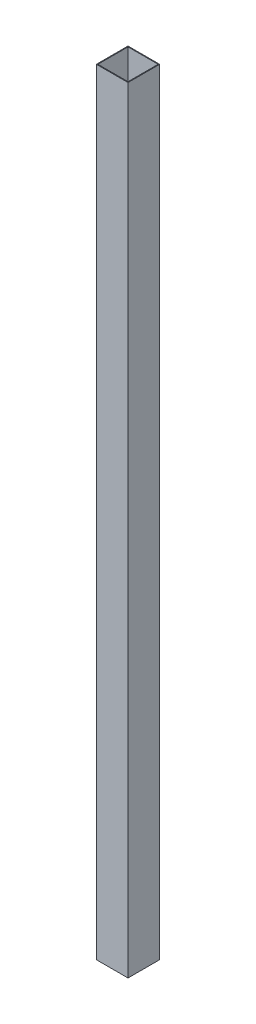
ISO-10303-21;
HEADER;
FILE_DESCRIPTION(('STEP AP214'),'2;1');
FILE_NAME('part.step','',(''),(''),'','','');
FILE_SCHEMA(('AUTOMOTIVE_DESIGN { 1 0 10303 214 1 1 1 1 }'));
ENDSEC;
DATA;
#1=APPLICATION_CONTEXT('core data for automotive mechanical design processes');
#2=APPLICATION_PROTOCOL_DEFINITION('international standard','automotive_design',2000,#1);
#3=PRODUCT_CONTEXT('',#1,'mechanical');
#4=PRODUCT('Part','Part','',(#3));
#5=PRODUCT_RELATED_PRODUCT_CATEGORY('part','',(#4));
#6=PRODUCT_DEFINITION_FORMATION('','',#4);
#7=PRODUCT_DEFINITION_CONTEXT('part definition',#1,'design');
#8=PRODUCT_DEFINITION('design','',#6,#7);
#9=PRODUCT_DEFINITION_SHAPE('','',#8);
#10=(LENGTH_UNIT() NAMED_UNIT(*) SI_UNIT(.MILLI.,.METRE.));
#11=(NAMED_UNIT(*) PLANE_ANGLE_UNIT() SI_UNIT($,.RADIAN.));
#12=(NAMED_UNIT(*) SI_UNIT($,.STERADIAN.) SOLID_ANGLE_UNIT());
#13=UNCERTAINTY_MEASURE_WITH_UNIT(LENGTH_MEASURE(1.E-05),#10,'distance_accuracy_value','');
#14=(GEOMETRIC_REPRESENTATION_CONTEXT(3) GLOBAL_UNCERTAINTY_ASSIGNED_CONTEXT((#13)) GLOBAL_UNIT_ASSIGNED_CONTEXT((#10,
#11,#12)) REPRESENTATION_CONTEXT('',''));
#15=CARTESIAN_POINT('',(0.,0.,0.));
#16=DIRECTION('',(0.,0.,1.));
#17=DIRECTION('',(1.,0.,0.));
#18=AXIS2_PLACEMENT_3D('',#15,#16,#17);
#19=CARTESIAN_POINT('',(0.,622.3,0.));
#20=DIRECTION('',(0.,1.,0.));
#21=DIRECTION('',(0.,0.,1.));
#22=AXIS2_PLACEMENT_3D('',#19,#20,#21);
#23=PLANE('',#22);
#24=DIRECTION('',(0.,0.,1.));
#25=VECTOR('',#24,1.);
#26=CARTESIAN_POINT('',(0.,622.3,0.));
#27=LINE('',#26,#25);
#28=CARTESIAN_POINT('',(0.,622.3,-25.4));
#29=VERTEX_POINT('',#28);
#30=CARTESIAN_POINT('',(0.,622.3,0.));
#31=VERTEX_POINT('',#30);
#32=EDGE_CURVE('E177',#29,#31,#27,.T.);
#33=ORIENTED_EDGE('',*,*,#32,.T.);
#34=DIRECTION('',(1.,0.,0.));
#35=VECTOR('',#34,1.);
#36=CARTESIAN_POINT('',(0.,622.3,0.));
#37=LINE('',#36,#35);
#38=CARTESIAN_POINT('',(25.4,622.3,0.));
#39=VERTEX_POINT('',#38);
#40=EDGE_CURVE('E181',#31,#39,#37,.T.);
#41=ORIENTED_EDGE('',*,*,#40,.T.);
#42=DIRECTION('',(0.,0.,-1.));
#43=VECTOR('',#42,1.);
#44=CARTESIAN_POINT('',(25.4,622.3,0.));
#45=LINE('',#44,#43);
#46=CARTESIAN_POINT('',(25.4,622.3,-25.4));
#47=VERTEX_POINT('',#46);
#48=EDGE_CURVE('E185',#39,#47,#45,.T.);
#49=ORIENTED_EDGE('',*,*,#48,.T.);
#50=DIRECTION('',(-1.,0.,0.));
#51=VECTOR('',#50,1.);
#52=CARTESIAN_POINT('',(0.,622.3,-25.4));
#53=LINE('',#52,#51);
#54=EDGE_CURVE('E188',#47,#29,#53,.T.);
#55=ORIENTED_EDGE('',*,*,#54,.T.);
#56=EDGE_LOOP('',(#33,#41,#49,#55));
#57=FACE_BOUND('',#56,.T.);
#58=DIRECTION('',(1.,0.,0.));
#59=VECTOR('',#58,1.);
#60=CARTESIAN_POINT('',(0.,622.3,-0.6));
#61=LINE('',#60,#59);
#62=CARTESIAN_POINT('',(0.6,622.3,-0.6));
#63=VERTEX_POINT('',#62);
#64=CARTESIAN_POINT('',(24.8,622.3,-0.6));
#65=VERTEX_POINT('',#64);
#66=EDGE_CURVE('E138',#63,#65,#61,.T.);
#67=ORIENTED_EDGE('',*,*,#66,.F.);
#68=DIRECTION('',(0.,0.,1.));
#69=VECTOR('',#68,1.);
#70=CARTESIAN_POINT('',(0.6,622.3,0.));
#71=LINE('',#70,#69);
#72=CARTESIAN_POINT('',(0.6,622.3,-24.8));
#73=VERTEX_POINT('',#72);
#74=EDGE_CURVE('E129',#73,#63,#71,.T.);
#75=ORIENTED_EDGE('',*,*,#74,.F.);
#76=DIRECTION('',(-1.,0.,0.));
#77=VECTOR('',#76,1.);
#78=CARTESIAN_POINT('',(0.,622.3,-24.8));
#79=LINE('',#78,#77);
#80=CARTESIAN_POINT('',(24.8,622.3,-24.8));
#81=VERTEX_POINT('',#80);
#82=EDGE_CURVE('E155',#81,#73,#79,.T.);
#83=ORIENTED_EDGE('',*,*,#82,.F.);
#84=DIRECTION('',(0.,0.,-1.));
#85=VECTOR('',#84,1.);
#86=CARTESIAN_POINT('',(24.8,622.3,0.));
#87=LINE('',#86,#85);
#88=EDGE_CURVE('E151',#65,#81,#87,.T.);
#89=ORIENTED_EDGE('',*,*,#88,.F.);
#90=EDGE_LOOP('',(#67,#75,#83,#89));
#91=FACE_BOUND('',#90,.T.);
#92=ADVANCED_FACE('F63',(#57,#91),#23,.T.);
#93=CARTESIAN_POINT('',(0.,0.,0.));
#94=DIRECTION('',(0.,1.,0.));
#95=DIRECTION('',(0.,0.,1.));
#96=AXIS2_PLACEMENT_3D('',#93,#94,#95);
#97=PLANE('',#96);
#98=DIRECTION('',(0.,0.,1.));
#99=VECTOR('',#98,1.);
#100=CARTESIAN_POINT('',(0.,0.,0.));
#101=LINE('',#100,#99);
#102=CARTESIAN_POINT('',(0.,0.,-25.4));
#103=VERTEX_POINT('',#102);
#104=CARTESIAN_POINT('',(0.,0.,0.));
#105=VERTEX_POINT('',#104);
#106=EDGE_CURVE('E147',#103,#105,#101,.T.);
#107=ORIENTED_EDGE('',*,*,#106,.F.);
#108=DIRECTION('',(-1.,0.,0.));
#109=VECTOR('',#108,1.);
#110=CARTESIAN_POINT('',(0.,0.,-25.4));
#111=LINE('',#110,#109);
#112=CARTESIAN_POINT('',(25.4,0.,-25.4));
#113=VERTEX_POINT('',#112);
#114=EDGE_CURVE('E182',#113,#103,#111,.T.);
#115=ORIENTED_EDGE('',*,*,#114,.F.);
#116=DIRECTION('',(0.,0.,-1.));
#117=VECTOR('',#116,1.);
#118=CARTESIAN_POINT('',(25.4,0.,0.));
#119=LINE('',#118,#117);
#120=CARTESIAN_POINT('',(25.4,0.,0.));
#121=VERTEX_POINT('',#120);
#122=EDGE_CURVE('E198',#121,#113,#119,.T.);
#123=ORIENTED_EDGE('',*,*,#122,.F.);
#124=DIRECTION('',(1.,0.,0.));
#125=VECTOR('',#124,1.);
#126=CARTESIAN_POINT('',(0.,0.,0.));
#127=LINE('',#126,#125);
#128=EDGE_CURVE('E195',#105,#121,#127,.T.);
#129=ORIENTED_EDGE('',*,*,#128,.F.);
#130=EDGE_LOOP('',(#107,#115,#123,#129));
#131=FACE_BOUND('',#130,.T.);
#132=DIRECTION('',(0.,0.,1.));
#133=VECTOR('',#132,1.);
#134=CARTESIAN_POINT('',(0.6,0.,0.));
#135=LINE('',#134,#133);
#136=CARTESIAN_POINT('',(0.6,0.,-24.8));
#137=VERTEX_POINT('',#136);
#138=CARTESIAN_POINT('',(0.6,0.,-0.6));
#139=VERTEX_POINT('',#138);
#140=EDGE_CURVE('E87',#137,#139,#135,.T.);
#141=ORIENTED_EDGE('',*,*,#140,.T.);
#142=DIRECTION('',(1.,0.,0.));
#143=VECTOR('',#142,1.);
#144=CARTESIAN_POINT('',(0.,0.,-0.6));
#145=LINE('',#144,#143);
#146=CARTESIAN_POINT('',(24.8,0.,-0.6));
#147=VERTEX_POINT('',#146);
#148=EDGE_CURVE('E145',#139,#147,#145,.T.);
#149=ORIENTED_EDGE('',*,*,#148,.T.);
#150=DIRECTION('',(0.,0.,-1.));
#151=VECTOR('',#150,1.);
#152=CARTESIAN_POINT('',(24.8,0.,0.));
#153=LINE('',#152,#151);
#154=CARTESIAN_POINT('',(24.8,0.,-24.8));
#155=VERTEX_POINT('',#154);
#156=EDGE_CURVE('E164',#147,#155,#153,.T.);
#157=ORIENTED_EDGE('',*,*,#156,.T.);
#158=DIRECTION('',(-1.,0.,0.));
#159=VECTOR('',#158,1.);
#160=CARTESIAN_POINT('',(0.,0.,-24.8));
#161=LINE('',#160,#159);
#162=EDGE_CURVE('E139',#155,#137,#161,.T.);
#163=ORIENTED_EDGE('',*,*,#162,.T.);
#164=EDGE_LOOP('',(#141,#149,#157,#163));
#165=FACE_BOUND('',#164,.T.);
#166=ADVANCED_FACE('F221',(#131,#165),#97,.F.);
#167=CARTESIAN_POINT('',(0.,622.3,0.));
#168=DIRECTION('',(1.,0.,0.));
#169=DIRECTION('',(0.,0.,-1.));
#170=AXIS2_PLACEMENT_3D('',#167,#168,#169);
#171=PLANE('',#170);
#172=ORIENTED_EDGE('',*,*,#106,.T.);
#173=DIRECTION('',(0.,-1.,0.));
#174=VECTOR('',#173,1.);
#175=CARTESIAN_POINT('',(0.,622.3,0.));
#176=LINE('',#175,#174);
#177=EDGE_CURVE('E12',#31,#105,#176,.T.);
#178=ORIENTED_EDGE('',*,*,#177,.F.);
#179=ORIENTED_EDGE('',*,*,#32,.F.);
#180=DIRECTION('',(0.,-1.,0.));
#181=VECTOR('',#180,1.);
#182=CARTESIAN_POINT('',(0.,622.3,-25.4));
#183=LINE('',#182,#181);
#184=EDGE_CURVE('E191',#29,#103,#183,.T.);
#185=ORIENTED_EDGE('',*,*,#184,.T.);
#186=EDGE_LOOP('',(#172,#178,#179,#185));
#187=FACE_BOUND('',#186,.T.);
#188=ADVANCED_FACE('F65',(#187),#171,.F.);
#189=CARTESIAN_POINT('',(0.,622.3,0.));
#190=DIRECTION('',(0.,0.,-1.));
#191=DIRECTION('',(-1.,0.,0.));
#192=AXIS2_PLACEMENT_3D('',#189,#190,#191);
#193=PLANE('',#192);
#194=ORIENTED_EDGE('',*,*,#128,.T.);
#195=DIRECTION('',(0.,-1.,0.));
#196=VECTOR('',#195,1.);
#197=CARTESIAN_POINT('',(25.4,622.3,0.));
#198=LINE('',#197,#196);
#199=EDGE_CURVE('E72',#39,#121,#198,.T.);
#200=ORIENTED_EDGE('',*,*,#199,.F.);
#201=ORIENTED_EDGE('',*,*,#40,.F.);
#202=ORIENTED_EDGE('',*,*,#177,.T.);
#203=EDGE_LOOP('',(#194,#200,#201,#202));
#204=FACE_BOUND('',#203,.T.);
#205=ADVANCED_FACE('F231',(#204),#193,.F.);
#206=CARTESIAN_POINT('',(25.4,622.3,0.));
#207=DIRECTION('',(-1.,0.,0.));
#208=DIRECTION('',(0.,0.,1.));
#209=AXIS2_PLACEMENT_3D('',#206,#207,#208);
#210=PLANE('',#209);
#211=ORIENTED_EDGE('',*,*,#122,.T.);
#212=DIRECTION('',(0.,-1.,0.));
#213=VECTOR('',#212,1.);
#214=CARTESIAN_POINT('',(25.4,622.3,-25.4));
#215=LINE('',#214,#213);
#216=EDGE_CURVE('E206',#47,#113,#215,.T.);
#217=ORIENTED_EDGE('',*,*,#216,.F.);
#218=ORIENTED_EDGE('',*,*,#48,.F.);
#219=ORIENTED_EDGE('',*,*,#199,.T.);
#220=EDGE_LOOP('',(#211,#217,#218,#219));
#221=FACE_BOUND('',#220,.T.);
#222=ADVANCED_FACE('F215',(#221),#210,.F.);
#223=CARTESIAN_POINT('',(0.,622.3,-25.4));
#224=DIRECTION('',(0.,0.,1.));
#225=DIRECTION('',(1.,0.,0.));
#226=AXIS2_PLACEMENT_3D('',#223,#224,#225);
#227=PLANE('',#226);
#228=ORIENTED_EDGE('',*,*,#114,.T.);
#229=ORIENTED_EDGE('',*,*,#184,.F.);
#230=ORIENTED_EDGE('',*,*,#54,.F.);
#231=ORIENTED_EDGE('',*,*,#216,.T.);
#232=EDGE_LOOP('',(#228,#229,#230,#231));
#233=FACE_BOUND('',#232,.T.);
#234=ADVANCED_FACE('F225',(#233),#227,.F.);
#235=CARTESIAN_POINT('',(0.6,622.3,0.));
#236=DIRECTION('',(1.,0.,0.));
#237=DIRECTION('',(0.,0.,-1.));
#238=AXIS2_PLACEMENT_3D('',#235,#236,#237);
#239=PLANE('',#238);
#240=ORIENTED_EDGE('',*,*,#140,.F.);
#241=DIRECTION('',(0.,-1.,0.));
#242=VECTOR('',#241,1.);
#243=CARTESIAN_POINT('',(0.6,622.3,-24.8));
#244=LINE('',#243,#242);
#245=EDGE_CURVE('E133',#73,#137,#244,.T.);
#246=ORIENTED_EDGE('',*,*,#245,.F.);
#247=ORIENTED_EDGE('',*,*,#74,.T.);
#248=DIRECTION('',(0.,-1.,0.));
#249=VECTOR('',#248,1.);
#250=CARTESIAN_POINT('',(0.6,622.3,-0.6));
#251=LINE('',#250,#249);
#252=EDGE_CURVE('E132',#63,#139,#251,.T.);
#253=ORIENTED_EDGE('',*,*,#252,.T.);
#254=EDGE_LOOP('',(#240,#246,#247,#253));
#255=FACE_BOUND('',#254,.T.);
#256=ADVANCED_FACE('F131',(#255),#239,.T.);
#257=CARTESIAN_POINT('',(0.,622.3,-0.6));
#258=DIRECTION('',(0.,0.,-1.));
#259=DIRECTION('',(-1.,0.,0.));
#260=AXIS2_PLACEMENT_3D('',#257,#258,#259);
#261=PLANE('',#260);
#262=ORIENTED_EDGE('',*,*,#148,.F.);
#263=ORIENTED_EDGE('',*,*,#252,.F.);
#264=ORIENTED_EDGE('',*,*,#66,.T.);
#265=DIRECTION('',(0.,-1.,0.));
#266=VECTOR('',#265,1.);
#267=CARTESIAN_POINT('',(24.8,622.3,-0.6));
#268=LINE('',#267,#266);
#269=EDGE_CURVE('E148',#65,#147,#268,.T.);
#270=ORIENTED_EDGE('',*,*,#269,.T.);
#271=EDGE_LOOP('',(#262,#263,#264,#270));
#272=FACE_BOUND('',#271,.T.);
#273=ADVANCED_FACE('F142',(#272),#261,.T.);
#274=CARTESIAN_POINT('',(24.8,622.3,0.));
#275=DIRECTION('',(-1.,0.,0.));
#276=DIRECTION('',(0.,0.,1.));
#277=AXIS2_PLACEMENT_3D('',#274,#275,#276);
#278=PLANE('',#277);
#279=ORIENTED_EDGE('',*,*,#156,.F.);
#280=ORIENTED_EDGE('',*,*,#269,.F.);
#281=ORIENTED_EDGE('',*,*,#88,.T.);
#282=DIRECTION('',(0.,-1.,0.));
#283=VECTOR('',#282,1.);
#284=CARTESIAN_POINT('',(24.8,622.3,-24.8));
#285=LINE('',#284,#283);
#286=EDGE_CURVE('E79',#81,#155,#285,.T.);
#287=ORIENTED_EDGE('',*,*,#286,.T.);
#288=EDGE_LOOP('',(#279,#280,#281,#287));
#289=FACE_BOUND('',#288,.T.);
#290=ADVANCED_FACE('F254',(#289),#278,.T.);
#291=CARTESIAN_POINT('',(0.,622.3,-24.8));
#292=DIRECTION('',(0.,0.,1.));
#293=DIRECTION('',(1.,0.,0.));
#294=AXIS2_PLACEMENT_3D('',#291,#292,#293);
#295=PLANE('',#294);
#296=ORIENTED_EDGE('',*,*,#162,.F.);
#297=ORIENTED_EDGE('',*,*,#286,.F.);
#298=ORIENTED_EDGE('',*,*,#82,.T.);
#299=ORIENTED_EDGE('',*,*,#245,.T.);
#300=EDGE_LOOP('',(#296,#297,#298,#299));
#301=FACE_BOUND('',#300,.T.);
#302=ADVANCED_FACE('F258',(#301),#295,.T.);
#303=CLOSED_SHELL('',(#92,#166,#188,#205,#222,#234,#256,#273,#290,#302));
#304=MANIFOLD_SOLID_BREP('B2',#303);
#305=ADVANCED_BREP_SHAPE_REPRESENTATION('',(#18,#304),#14);
#306=SHAPE_DEFINITION_REPRESENTATION(#9,#305);
ENDSEC;
END-ISO-10303-21;
